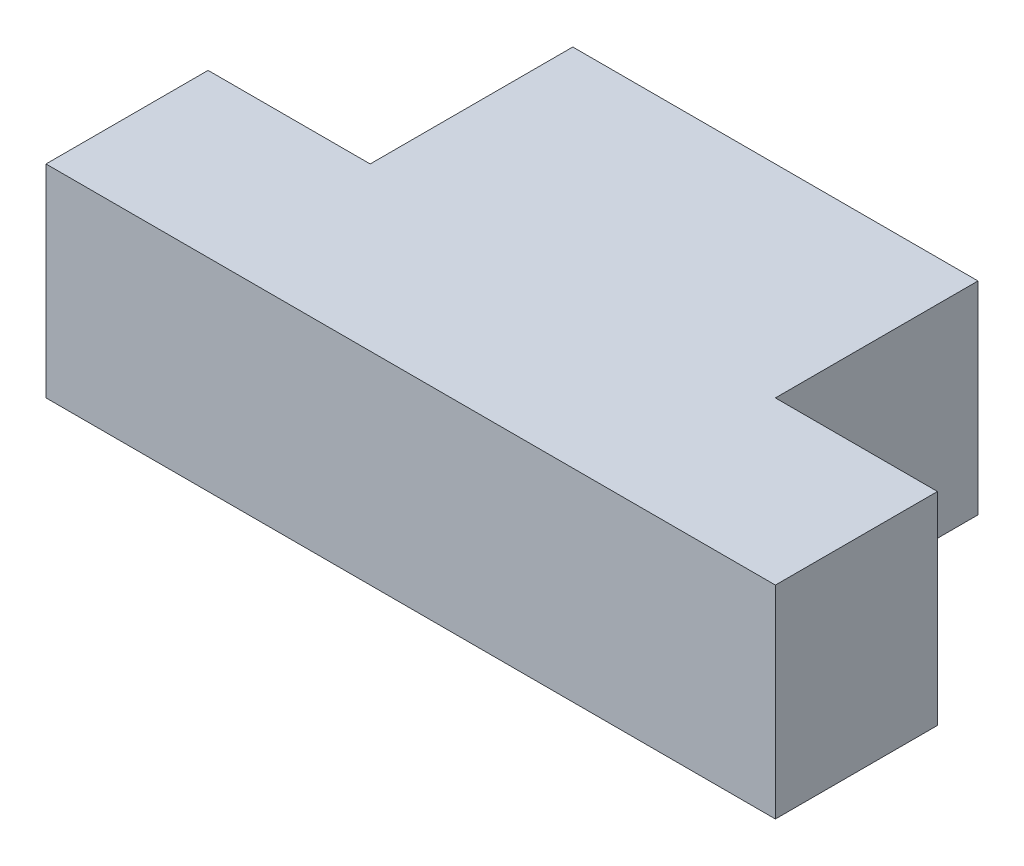
ISO-10303-21;
HEADER;
FILE_DESCRIPTION(('STEP AP214'),'2;1');
FILE_NAME('part.step','',(''),(''),'','','');
FILE_SCHEMA(('AUTOMOTIVE_DESIGN { 1 0 10303 214 1 1 1 1 }'));
ENDSEC;
DATA;
#1=APPLICATION_CONTEXT('core data for automotive mechanical design processes');
#2=APPLICATION_PROTOCOL_DEFINITION('international standard','automotive_design',2000,#1);
#3=PRODUCT_CONTEXT('',#1,'mechanical');
#4=PRODUCT('Part','Part','',(#3));
#5=PRODUCT_RELATED_PRODUCT_CATEGORY('part','',(#4));
#6=PRODUCT_DEFINITION_FORMATION('','',#4);
#7=PRODUCT_DEFINITION_CONTEXT('part definition',#1,'design');
#8=PRODUCT_DEFINITION('design','',#6,#7);
#9=PRODUCT_DEFINITION_SHAPE('','',#8);
#10=(LENGTH_UNIT() NAMED_UNIT(*) SI_UNIT(.MILLI.,.METRE.));
#11=(NAMED_UNIT(*) PLANE_ANGLE_UNIT() SI_UNIT($,.RADIAN.));
#12=(NAMED_UNIT(*) SI_UNIT($,.STERADIAN.) SOLID_ANGLE_UNIT());
#13=UNCERTAINTY_MEASURE_WITH_UNIT(LENGTH_MEASURE(1.E-05),#10,'distance_accuracy_value','');
#14=(GEOMETRIC_REPRESENTATION_CONTEXT(3) GLOBAL_UNCERTAINTY_ASSIGNED_CONTEXT((#13)) GLOBAL_UNIT_ASSIGNED_CONTEXT((#10,
#11,#12)) REPRESENTATION_CONTEXT('',''));
#15=CARTESIAN_POINT('',(0.,0.,0.));
#16=DIRECTION('',(0.,0.,1.));
#17=DIRECTION('',(1.,0.,0.));
#18=AXIS2_PLACEMENT_3D('',#15,#16,#17);
#19=CARTESIAN_POINT('',(-3.15873015873016,2.5,-0.380952380952381));
#20=DIRECTION('',(1.,0.,0.));
#21=DIRECTION('',(0.,0.,-1.));
#22=AXIS2_PLACEMENT_3D('',#19,#20,#21);
#23=PLANE('',#22);
#24=DIRECTION('',(0.,0.,1.));
#25=VECTOR('',#24,1.);
#26=CARTESIAN_POINT('',(-3.15873015873016,0.,-0.380952380952381));
#27=LINE('',#26,#25);
#28=CARTESIAN_POINT('',(-3.15873015873016,0.,-0.380952380952381));
#29=VERTEX_POINT('',#28);
#30=CARTESIAN_POINT('',(-3.15873015873016,0.,1.61904761904762));
#31=VERTEX_POINT('',#30);
#32=EDGE_CURVE('E140',#29,#31,#27,.T.);
#33=ORIENTED_EDGE('',*,*,#32,.T.);
#34=DIRECTION('',(0.,-1.,0.));
#35=VECTOR('',#34,1.);
#36=CARTESIAN_POINT('',(-3.15873015873016,2.5,1.61904761904762));
#37=LINE('',#36,#35);
#38=CARTESIAN_POINT('',(-3.15873015873016,2.5,1.61904761904762));
#39=VERTEX_POINT('',#38);
#40=EDGE_CURVE('E11',#39,#31,#37,.T.);
#41=ORIENTED_EDGE('',*,*,#40,.F.);
#42=DIRECTION('',(0.,0.,1.));
#43=VECTOR('',#42,1.);
#44=CARTESIAN_POINT('',(-3.15873015873016,2.5,-0.380952380952381));
#45=LINE('',#44,#43);
#46=CARTESIAN_POINT('',(-3.15873015873016,2.5,-0.380952380952381));
#47=VERTEX_POINT('',#46);
#48=EDGE_CURVE('E162',#47,#39,#45,.T.);
#49=ORIENTED_EDGE('',*,*,#48,.F.);
#50=DIRECTION('',(0.,-1.,0.));
#51=VECTOR('',#50,1.);
#52=CARTESIAN_POINT('',(-3.15873015873016,2.5,-0.380952380952381));
#53=LINE('',#52,#51);
#54=EDGE_CURVE('E136',#47,#29,#53,.T.);
#55=ORIENTED_EDGE('',*,*,#54,.T.);
#56=EDGE_LOOP('',(#33,#41,#49,#55));
#57=FACE_BOUND('',#56,.T.);
#58=ADVANCED_FACE('F39',(#57),#23,.F.);
#59=CARTESIAN_POINT('',(-3.15873015873016,2.5,1.61904761904762));
#60=DIRECTION('',(0.,0.,-1.));
#61=DIRECTION('',(-1.,0.,0.));
#62=AXIS2_PLACEMENT_3D('',#59,#60,#61);
#63=PLANE('',#62);
#64=DIRECTION('',(1.,0.,0.));
#65=VECTOR('',#64,1.);
#66=CARTESIAN_POINT('',(-3.15873015873016,0.,1.61904761904762));
#67=LINE('',#66,#65);
#68=CARTESIAN_POINT('',(5.84126984126984,0.,1.61904761904762));
#69=VERTEX_POINT('',#68);
#70=EDGE_CURVE('E144',#31,#69,#67,.T.);
#71=ORIENTED_EDGE('',*,*,#70,.T.);
#72=DIRECTION('',(0.,-1.,0.));
#73=VECTOR('',#72,1.);
#74=CARTESIAN_POINT('',(5.84126984126984,2.5,1.61904761904762));
#75=LINE('',#74,#73);
#76=CARTESIAN_POINT('',(5.84126984126984,2.5,1.61904761904762));
#77=VERTEX_POINT('',#76);
#78=EDGE_CURVE('E48',#77,#69,#75,.T.);
#79=ORIENTED_EDGE('',*,*,#78,.F.);
#80=DIRECTION('',(1.,0.,0.));
#81=VECTOR('',#80,1.);
#82=CARTESIAN_POINT('',(-3.15873015873016,2.5,1.61904761904762));
#83=LINE('',#82,#81);
#84=EDGE_CURVE('E99',#39,#77,#83,.T.);
#85=ORIENTED_EDGE('',*,*,#84,.F.);
#86=ORIENTED_EDGE('',*,*,#40,.T.);
#87=EDGE_LOOP('',(#71,#79,#85,#86));
#88=FACE_BOUND('',#87,.T.);
#89=ADVANCED_FACE('F208',(#88),#63,.F.);
#90=CARTESIAN_POINT('',(5.84126984126984,2.5,1.61904761904762));
#91=DIRECTION('',(-1.,0.,0.));
#92=DIRECTION('',(0.,0.,1.));
#93=AXIS2_PLACEMENT_3D('',#90,#91,#92);
#94=PLANE('',#93);
#95=DIRECTION('',(0.,0.,-1.));
#96=VECTOR('',#95,1.);
#97=CARTESIAN_POINT('',(5.84126984126984,0.,1.61904761904762));
#98=LINE('',#97,#96);
#99=CARTESIAN_POINT('',(5.84126984126984,0.,-0.380952380952382));
#100=VERTEX_POINT('',#99);
#101=EDGE_CURVE('E147',#69,#100,#98,.T.);
#102=ORIENTED_EDGE('',*,*,#101,.T.);
#103=DIRECTION('',(0.,-1.,0.));
#104=VECTOR('',#103,1.);
#105=CARTESIAN_POINT('',(5.84126984126984,2.5,-0.380952380952382));
#106=LINE('',#105,#104);
#107=CARTESIAN_POINT('',(5.84126984126984,2.5,-0.380952380952382));
#108=VERTEX_POINT('',#107);
#109=EDGE_CURVE('E173',#108,#100,#106,.T.);
#110=ORIENTED_EDGE('',*,*,#109,.F.);
#111=DIRECTION('',(0.,0.,-1.));
#112=VECTOR('',#111,1.);
#113=CARTESIAN_POINT('',(5.84126984126984,2.5,1.61904761904762));
#114=LINE('',#113,#112);
#115=EDGE_CURVE('E183',#77,#108,#114,.T.);
#116=ORIENTED_EDGE('',*,*,#115,.F.);
#117=ORIENTED_EDGE('',*,*,#78,.T.);
#118=EDGE_LOOP('',(#102,#110,#116,#117));
#119=FACE_BOUND('',#118,.T.);
#120=ADVANCED_FACE('F181',(#119),#94,.F.);
#121=CARTESIAN_POINT('',(5.84126984126984,2.5,-0.380952380952382));
#122=DIRECTION('',(0.,0.,1.));
#123=DIRECTION('',(1.,0.,0.));
#124=AXIS2_PLACEMENT_3D('',#121,#122,#123);
#125=PLANE('',#124);
#126=DIRECTION('',(-1.,0.,0.));
#127=VECTOR('',#126,1.);
#128=CARTESIAN_POINT('',(5.84126984126984,0.,-0.380952380952382));
#129=LINE('',#128,#127);
#130=CARTESIAN_POINT('',(3.84126984126984,0.,-0.380952380952382));
#131=VERTEX_POINT('',#130);
#132=EDGE_CURVE('E150',#100,#131,#129,.T.);
#133=ORIENTED_EDGE('',*,*,#132,.T.);
#134=DIRECTION('',(0.,-1.,0.));
#135=VECTOR('',#134,1.);
#136=CARTESIAN_POINT('',(3.84126984126984,2.5,-0.380952380952382));
#137=LINE('',#136,#135);
#138=CARTESIAN_POINT('',(3.84126984126984,2.5,-0.380952380952382));
#139=VERTEX_POINT('',#138);
#140=EDGE_CURVE('E169',#139,#131,#137,.T.);
#141=ORIENTED_EDGE('',*,*,#140,.F.);
#142=DIRECTION('',(-1.,0.,0.));
#143=VECTOR('',#142,1.);
#144=CARTESIAN_POINT('',(5.84126984126984,2.5,-0.380952380952382));
#145=LINE('',#144,#143);
#146=EDGE_CURVE('E196',#108,#139,#145,.T.);
#147=ORIENTED_EDGE('',*,*,#146,.F.);
#148=ORIENTED_EDGE('',*,*,#109,.T.);
#149=EDGE_LOOP('',(#133,#141,#147,#148));
#150=FACE_BOUND('',#149,.T.);
#151=ADVANCED_FACE('F191',(#150),#125,.F.);
#152=CARTESIAN_POINT('',(3.84126984126984,2.5,-0.380952380952382));
#153=DIRECTION('',(-1.,0.,0.));
#154=DIRECTION('',(0.,0.,1.));
#155=AXIS2_PLACEMENT_3D('',#152,#153,#154);
#156=PLANE('',#155);
#157=DIRECTION('',(0.,0.,-1.));
#158=VECTOR('',#157,1.);
#159=CARTESIAN_POINT('',(3.84126984126984,0.,-0.380952380952382));
#160=LINE('',#159,#158);
#161=CARTESIAN_POINT('',(3.84126984126984,0.,-2.88095238095238));
#162=VERTEX_POINT('',#161);
#163=EDGE_CURVE('E153',#131,#162,#160,.T.);
#164=ORIENTED_EDGE('',*,*,#163,.T.);
#165=DIRECTION('',(0.,-1.,0.));
#166=VECTOR('',#165,1.);
#167=CARTESIAN_POINT('',(3.84126984126984,2.5,-2.88095238095238));
#168=LINE('',#167,#166);
#169=CARTESIAN_POINT('',(3.84126984126984,2.5,-2.88095238095238));
#170=VERTEX_POINT('',#169);
#171=EDGE_CURVE('E129',#170,#162,#168,.T.);
#172=ORIENTED_EDGE('',*,*,#171,.F.);
#173=DIRECTION('',(0.,0.,-1.));
#174=VECTOR('',#173,1.);
#175=CARTESIAN_POINT('',(3.84126984126984,2.5,-0.380952380952382));
#176=LINE('',#175,#174);
#177=EDGE_CURVE('E118',#139,#170,#176,.T.);
#178=ORIENTED_EDGE('',*,*,#177,.F.);
#179=ORIENTED_EDGE('',*,*,#140,.T.);
#180=EDGE_LOOP('',(#164,#172,#178,#179));
#181=FACE_BOUND('',#180,.T.);
#182=ADVANCED_FACE('F194',(#181),#156,.F.);
#183=CARTESIAN_POINT('',(3.84126984126984,2.5,-2.88095238095238));
#184=DIRECTION('',(0.,0.,1.));
#185=DIRECTION('',(1.,0.,0.));
#186=AXIS2_PLACEMENT_3D('',#183,#184,#185);
#187=PLANE('',#186);
#188=DIRECTION('',(-1.,0.,0.));
#189=VECTOR('',#188,1.);
#190=CARTESIAN_POINT('',(3.84126984126984,0.,-2.88095238095238));
#191=LINE('',#190,#189);
#192=CARTESIAN_POINT('',(-1.15873015873016,0.,-2.88095238095238));
#193=VERTEX_POINT('',#192);
#194=EDGE_CURVE('E127',#162,#193,#191,.T.);
#195=ORIENTED_EDGE('',*,*,#194,.T.);
#196=DIRECTION('',(0.,-1.,0.));
#197=VECTOR('',#196,1.);
#198=CARTESIAN_POINT('',(-1.15873015873016,2.5,-2.88095238095238));
#199=LINE('',#198,#197);
#200=CARTESIAN_POINT('',(-1.15873015873016,2.5,-2.88095238095238));
#201=VERTEX_POINT('',#200);
#202=EDGE_CURVE('E124',#201,#193,#199,.T.);
#203=ORIENTED_EDGE('',*,*,#202,.F.);
#204=DIRECTION('',(-1.,0.,0.));
#205=VECTOR('',#204,1.);
#206=CARTESIAN_POINT('',(3.84126984126984,2.5,-2.88095238095238));
#207=LINE('',#206,#205);
#208=EDGE_CURVE('E112',#170,#201,#207,.T.);
#209=ORIENTED_EDGE('',*,*,#208,.F.);
#210=ORIENTED_EDGE('',*,*,#171,.T.);
#211=EDGE_LOOP('',(#195,#203,#209,#210));
#212=FACE_BOUND('',#211,.T.);
#213=ADVANCED_FACE('F125',(#212),#187,.F.);
#214=CARTESIAN_POINT('',(-1.15873015873016,2.5,-2.88095238095238));
#215=DIRECTION('',(1.,0.,0.));
#216=DIRECTION('',(0.,0.,-1.));
#217=AXIS2_PLACEMENT_3D('',#214,#215,#216);
#218=PLANE('',#217);
#219=DIRECTION('',(0.,0.,1.));
#220=VECTOR('',#219,1.);
#221=CARTESIAN_POINT('',(-1.15873015873016,0.,-2.88095238095238));
#222=LINE('',#221,#220);
#223=CARTESIAN_POINT('',(-1.15873015873016,0.,-0.380952380952382));
#224=VERTEX_POINT('',#223);
#225=EDGE_CURVE('E85',#193,#224,#222,.T.);
#226=ORIENTED_EDGE('',*,*,#225,.T.);
#227=DIRECTION('',(0.,-1.,0.));
#228=VECTOR('',#227,1.);
#229=CARTESIAN_POINT('',(-1.15873015873016,2.5,-0.380952380952382));
#230=LINE('',#229,#228);
#231=CARTESIAN_POINT('',(-1.15873015873016,2.5,-0.380952380952382));
#232=VERTEX_POINT('',#231);
#233=EDGE_CURVE('E130',#232,#224,#230,.T.);
#234=ORIENTED_EDGE('',*,*,#233,.F.);
#235=DIRECTION('',(0.,0.,1.));
#236=VECTOR('',#235,1.);
#237=CARTESIAN_POINT('',(-1.15873015873016,2.5,-2.88095238095238));
#238=LINE('',#237,#236);
#239=EDGE_CURVE('E116',#201,#232,#238,.T.);
#240=ORIENTED_EDGE('',*,*,#239,.F.);
#241=ORIENTED_EDGE('',*,*,#202,.T.);
#242=EDGE_LOOP('',(#226,#234,#240,#241));
#243=FACE_BOUND('',#242,.T.);
#244=ADVANCED_FACE('F132',(#243),#218,.F.);
#245=CARTESIAN_POINT('',(-1.15873015873016,2.5,-0.380952380952382));
#246=DIRECTION('',(0.,0.,1.));
#247=DIRECTION('',(1.,0.,0.));
#248=AXIS2_PLACEMENT_3D('',#245,#246,#247);
#249=PLANE('',#248);
#250=DIRECTION('',(-1.,0.,0.));
#251=VECTOR('',#250,1.);
#252=CARTESIAN_POINT('',(-1.15873015873016,0.,-0.380952380952382));
#253=LINE('',#252,#251);
#254=EDGE_CURVE('E91',#224,#29,#253,.T.);
#255=ORIENTED_EDGE('',*,*,#254,.T.);
#256=ORIENTED_EDGE('',*,*,#54,.F.);
#257=DIRECTION('',(-1.,0.,0.));
#258=VECTOR('',#257,1.);
#259=CARTESIAN_POINT('',(-1.15873015873016,2.5,-0.380952380952382));
#260=LINE('',#259,#258);
#261=EDGE_CURVE('E56',#232,#47,#260,.T.);
#262=ORIENTED_EDGE('',*,*,#261,.F.);
#263=ORIENTED_EDGE('',*,*,#233,.T.);
#264=EDGE_LOOP('',(#255,#256,#262,#263));
#265=FACE_BOUND('',#264,.T.);
#266=ADVANCED_FACE('F224',(#265),#249,.F.);
#267=CARTESIAN_POINT('',(0.,2.5,0.));
#268=DIRECTION('',(0.,1.,0.));
#269=DIRECTION('',(0.,0.,1.));
#270=AXIS2_PLACEMENT_3D('',#267,#268,#269);
#271=PLANE('',#270);
#272=ORIENTED_EDGE('',*,*,#48,.T.);
#273=ORIENTED_EDGE('',*,*,#84,.T.);
#274=ORIENTED_EDGE('',*,*,#115,.T.);
#275=ORIENTED_EDGE('',*,*,#146,.T.);
#276=ORIENTED_EDGE('',*,*,#177,.T.);
#277=ORIENTED_EDGE('',*,*,#208,.T.);
#278=ORIENTED_EDGE('',*,*,#239,.T.);
#279=ORIENTED_EDGE('',*,*,#261,.T.);
#280=EDGE_LOOP('',(#272,#273,#274,#275,#276,#277,#278,#279));
#281=FACE_BOUND('',#280,.T.);
#282=ADVANCED_FACE('F114',(#281),#271,.T.);
#283=CARTESIAN_POINT('',(0.,0.,0.));
#284=DIRECTION('',(0.,1.,0.));
#285=DIRECTION('',(0.,0.,1.));
#286=AXIS2_PLACEMENT_3D('',#283,#284,#285);
#287=PLANE('',#286);
#288=ORIENTED_EDGE('',*,*,#32,.F.);
#289=ORIENTED_EDGE('',*,*,#254,.F.);
#290=ORIENTED_EDGE('',*,*,#225,.F.);
#291=ORIENTED_EDGE('',*,*,#194,.F.);
#292=ORIENTED_EDGE('',*,*,#163,.F.);
#293=ORIENTED_EDGE('',*,*,#132,.F.);
#294=ORIENTED_EDGE('',*,*,#101,.F.);
#295=ORIENTED_EDGE('',*,*,#70,.F.);
#296=EDGE_LOOP('',(#288,#289,#290,#291,#292,#293,#294,#295));
#297=FACE_BOUND('',#296,.T.);
#298=ADVANCED_FACE('F187',(#297),#287,.F.);
#299=CLOSED_SHELL('',(#58,#89,#120,#151,#182,#213,#244,#266,#282,#298));
#300=MANIFOLD_SOLID_BREP('B2',#299);
#301=ADVANCED_BREP_SHAPE_REPRESENTATION('',(#18,#300),#14);
#302=SHAPE_DEFINITION_REPRESENTATION(#9,#301);
ENDSEC;
END-ISO-10303-21;
